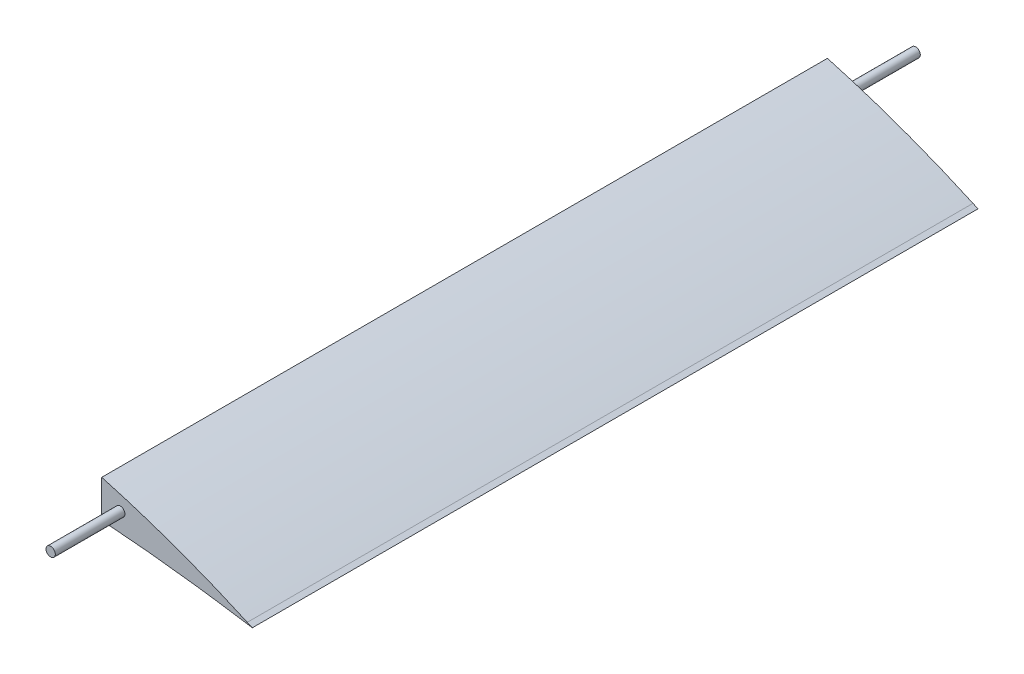
ISO-10303-21;
HEADER;
FILE_DESCRIPTION(('STEP AP214'),'2;1');
FILE_NAME('part.step','',(''),(''),'','','');
FILE_SCHEMA(('AUTOMOTIVE_DESIGN { 1 0 10303 214 1 1 1 1 }'));
ENDSEC;
DATA;
#1=APPLICATION_CONTEXT('core data for automotive mechanical design processes');
#2=APPLICATION_PROTOCOL_DEFINITION('international standard','automotive_design',2000,#1);
#3=PRODUCT_CONTEXT('',#1,'mechanical');
#4=PRODUCT('Part','Part','',(#3));
#5=PRODUCT_RELATED_PRODUCT_CATEGORY('part','',(#4));
#6=PRODUCT_DEFINITION_FORMATION('','',#4);
#7=PRODUCT_DEFINITION_CONTEXT('part definition',#1,'design');
#8=PRODUCT_DEFINITION('design','',#6,#7);
#9=PRODUCT_DEFINITION_SHAPE('','',#8);
#10=(LENGTH_UNIT() NAMED_UNIT(*) SI_UNIT(.MILLI.,.METRE.));
#11=(NAMED_UNIT(*) PLANE_ANGLE_UNIT() SI_UNIT($,.RADIAN.));
#12=(NAMED_UNIT(*) SI_UNIT($,.STERADIAN.) SOLID_ANGLE_UNIT());
#13=UNCERTAINTY_MEASURE_WITH_UNIT(LENGTH_MEASURE(1.E-05),#10,'distance_accuracy_value','');
#14=(GEOMETRIC_REPRESENTATION_CONTEXT(3) GLOBAL_UNCERTAINTY_ASSIGNED_CONTEXT((#13)) GLOBAL_UNIT_ASSIGNED_CONTEXT((#10,
#11,#12)) REPRESENTATION_CONTEXT('',''));
#15=CARTESIAN_POINT('',(0.,0.,0.));
#16=DIRECTION('',(0.,0.,1.));
#17=DIRECTION('',(1.,0.,0.));
#18=AXIS2_PLACEMENT_3D('',#15,#16,#17);
#19=CARTESIAN_POINT('',(250.0905,0.30175,156.25));
#20=CARTESIAN_POINT('',(249.967176894107,0.35752263832299,156.25));
#21=CARTESIAN_POINT('',(249.474705498551,0.580241883268078,156.25));
#22=CARTESIAN_POINT('',(248.368757841346,1.07747841310591,156.25));
#23=CARTESIAN_POINT('',(246.531056029016,1.8955784525877,156.25));
#24=CARTESIAN_POINT('',(243.970022782219,3.01871731606201,156.25));
#25=CARTESIAN_POINT('',(240.697484765675,4.42532167786361,156.25));
#26=CARTESIAN_POINT('',(236.72871806395,6.08814206011202,156.25));
#27=CARTESIAN_POINT('',(232.08320517829,7.97657015835399,156.25));
#28=CARTESIAN_POINT('',(226.7833477577,10.0543704050555,156.25));
#29=CARTESIAN_POINT('',(220.856263163566,12.2844632604579,156.25));
#30=CARTESIAN_POINT('',(214.33217995918,14.6253764831239,156.25));
#31=CARTESIAN_POINT('',(207.245873813889,17.0358391078329,156.25));
#32=CARTESIAN_POINT('',(199.635416935447,19.4725979309981,156.25));
#33=CARTESIAN_POINT('',(191.543137513553,21.8940901724419,156.25));
#34=CARTESIAN_POINT('',(183.014600537797,24.2576215915466,156.25));
#35=CARTESIAN_POINT('',(174.099363422309,26.5236055211011,156.25));
#36=CARTESIAN_POINT('',(164.849737603738,28.6527939579007,156.25));
#37=CARTESIAN_POINT('',(155.321752945394,30.6101951561386,156.25));
#38=CARTESIAN_POINT('',(145.574009320711,32.3628245621865,156.25));
#39=CARTESIAN_POINT('',(135.667857387076,33.8811203699661,156.25));
#40=CARTESIAN_POINT('',(125.666902669661,35.1397615192391,156.25));
#41=CARTESIAN_POINT('',(115.636778893083,36.1206951492421,156.25));
#42=CARTESIAN_POINT('',(105.594273822087,36.8040052373818,156.25));
#43=CARTESIAN_POINT('',(95.5386046152796,37.2048647786239,156.25));
#44=CARTESIAN_POINT('',(85.5334056894228,37.0417263557673,156.25));
#45=CARTESIAN_POINT('',(75.7162960028254,36.3460959013947,156.25));
#46=CARTESIAN_POINT('',(66.2327620791649,35.1462170608954,156.25));
#47=CARTESIAN_POINT('',(57.1612116585277,33.4870765936034,156.25));
#48=CARTESIAN_POINT('',(48.5745049403176,31.4247912402868,156.25));
#49=CARTESIAN_POINT('',(40.5394774491885,29.0234987715588,156.25));
#50=CARTESIAN_POINT('',(33.115756055849,26.3532239519005,156.25));
#51=CARTESIAN_POINT('',(26.3548013936068,23.4891938725338,156.25));
#52=CARTESIAN_POINT('',(20.2996352467683,20.5079300900761,156.25));
#53=CARTESIAN_POINT('',(14.985645432496,17.4842654454087,156.25));
#54=CARTESIAN_POINT('',(10.4389786574652,14.4912006544606,156.25));
#55=CARTESIAN_POINT('',(6.67800459667388,11.594758891072,156.25));
#56=CARTESIAN_POINT('',(3.71136110093971,8.85416843805436,156.25));
#57=CARTESIAN_POINT('',(1.53823778576287,6.31212100896774,156.25));
#58=CARTESIAN_POINT('',(0.150943097082421,3.99275266874957,156.25));
#59=CARTESIAN_POINT('',(-0.45614444229955,1.86405090981703,156.25));
#60=CARTESIAN_POINT('',(-0.145525786677318,-0.065678088071413,156.25));
#61=CARTESIAN_POINT('',(1.08739732510381,-1.57294223073602,156.25));
#62=CARTESIAN_POINT('',(3.04410280394939,-2.55158975669719,156.25));
#63=CARTESIAN_POINT('',(5.62541535338876,-3.12732752291929,156.25));
#64=CARTESIAN_POINT('',(8.8497907217855,-3.3551071695402,156.25));
#65=CARTESIAN_POINT('',(12.7045781823942,-3.26532942676434,156.25));
#66=CARTESIAN_POINT('',(17.1664203240035,-2.8881845510984,156.25));
#67=CARTESIAN_POINT('',(22.2028231197661,-2.2588386733316,156.25));
#68=CARTESIAN_POINT('',(27.7780430977115,-1.4178584524104,156.25));
#69=CARTESIAN_POINT('',(33.8542296815651,-0.407944024477627,156.25));
#70=CARTESIAN_POINT('',(40.3935268972945,0.722155474864518,156.25));
#71=CARTESIAN_POINT('',(47.3584639067136,1.92451417724157,156.25));
#72=CARTESIAN_POINT('',(54.7128381517971,3.14855921730592,156.25));
#73=CARTESIAN_POINT('',(62.4221188769073,4.34307850532654,156.25));
#74=CARTESIAN_POINT('',(70.4527646582886,5.45916854662171,156.25));
#75=CARTESIAN_POINT('',(78.7726503907477,6.44689167487461,156.25));
#76=CARTESIAN_POINT('',(87.3496429571334,7.26032455065863,156.25));
#77=CARTESIAN_POINT('',(96.2164638973013,7.8657481871473,156.25));
#78=CARTESIAN_POINT('',(105.384748536779,8.19610237970071,156.25));
#79=CARTESIAN_POINT('',(114.799513923917,8.48271364631913,156.25));
#80=CARTESIAN_POINT('',(124.348002519004,8.67384076630889,156.25));
#81=CARTESIAN_POINT('',(133.92514247836,8.7623241387427,156.25));
#82=CARTESIAN_POINT('',(143.475961555672,8.73632206981546,156.25));
#83=CARTESIAN_POINT('',(152.943999166261,8.59083900117681,156.25));
#84=CARTESIAN_POINT('',(162.272123673613,8.32655777834714,156.25));
#85=CARTESIAN_POINT('',(171.402666565114,7.9474255607619,156.25));
#86=CARTESIAN_POINT('',(180.278148269656,7.46252101091327,156.25));
#87=CARTESIAN_POINT('',(188.841392746962,6.88515378248476,156.25));
#88=CARTESIAN_POINT('',(197.036321835174,6.23087848886346,156.25));
#89=CARTESIAN_POINT('',(204.808324468592,5.51937507217559,156.25));
#90=CARTESIAN_POINT('',(212.104795112002,4.77110575381297,156.25));
#91=CARTESIAN_POINT('',(218.875568901886,4.00838196618106,156.25));
#92=CARTESIAN_POINT('',(225.073163797839,3.25261839708756,156.25));
#93=CARTESIAN_POINT('',(230.653596279947,2.52670852152898,156.25));
#94=CARTESIAN_POINT('',(235.576611829964,1.85043624235467,156.25));
#95=CARTESIAN_POINT('',(239.806204058984,1.24361891202603,156.25));
#96=CARTESIAN_POINT('',(243.311102365703,0.722290417982436,156.25));
#97=CARTESIAN_POINT('',(246.065118996063,0.301639984631635,156.25));
#98=CARTESIAN_POINT('',(248.04751140267,-0.00699818541889293,156.25));
#99=CARTESIAN_POINT('',(249.243010727156,-0.195573538045246,156.25));
#100=CARTESIAN_POINT('',(249.776002712031,-0.280482936455744,156.25));
#101=CARTESIAN_POINT('',(249.9095,-0.30175,156.25));
#102=B_SPLINE_CURVE_WITH_KNOTS('',3,(#19,#20,#21,#22,#23,#24,#25,#26,#27,#28,#29,#30,#31,#32,
#33,#34,#35,#36,#37,#38,#39,#40,#41,#42,#43,#44,#45,#46,#47,#48,#49,#50,#51,#52,#53,#54,#55,#56,
#57,#58,#59,#60,#61,#62,#63,#64,#65,#66,#67,#68,#69,#70,#71,#72,#73,#74,#75,#76,#77,#78,#79,#80,
#81,#82,#83,#84,#85,#86,#87,#88,#89,#90,#91,#92,#93,#94,#95,#96,#97,#98,#99,#100,#101),
.UNSPECIFIED.,.F.,.F.,(4,1,1,1,1,1,1,1,1,1,1,1,1,1,1,1,1,1,1,1,1,1,1,1,1,1,1,1,1,1,1,1,1,1,1,1,
1,1,1,1,1,1,1,1,1,1,1,1,1,1,1,1,1,1,1,1,1,1,1,1,1,1,1,1,1,1,1,1,1,1,1,1,1,1,1,1,1,1,1,1,4),(0.,
0.000780388582183262,0.00311635886366124,0.00699149024413847,0.0123786470723059,
0.0192401646191993,0.0275291163956377,0.0371885677458252,0.0481530149942945,0.0603504660709447,
0.0737004760732217,0.0881159007981916,0.103505480558388,0.119772437793277,0.136815166052434,
0.154528798804682,0.172805819916139,0.191536294297057,0.210606876525922,0.229904323703461,
0.249313148598133,0.268718115521033,0.288002831649334,0.307344574500995,0.326724912273379,
0.345665288003051,0.364062547904339,0.381812466131485,0.398810766796609,0.414954014976396,
0.43014108756859,0.44427604266255,0.457267491040306,0.469034145220341,0.479505483532797,
0.488628424505395,0.496374594308399,0.502754708449354,0.507846672805521,0.511863744250018,
0.515266594313617,0.518668431045945,0.522659442278019,0.527659106471716,0.533842014714074,
0.541252425567551,0.549872189932492,0.559649205945231,0.570512404563009,0.582379277891623,
0.595163200370055,0.608775429693724,0.623131519501752,0.638149690065564,0.653754504916732,
0.669877063709413,0.686453174210341,0.703424810142813,0.721111475555369,0.739345596232821,
0.75773392648224,0.776175562292332,0.794566548903596,0.812800595558257,0.830771125027306,
0.848370488551265,0.865489121687924,0.882020076559578,0.897855051622748,0.912888480818679,
0.927018156079293,0.940144761538347,0.952173577153425,0.963016384231875,0.972591069873466,
0.980824955512395,0.987652854315412,0.993021794116182,0.996888134736393,0.99922057819816,1.),.UNSPECIFIED.);
#103=DIRECTION('',(0.,0.,-1.));
#104=VECTOR('',#103,1.);
#105=SURFACE_OF_LINEAR_EXTRUSION('',#102,#104);
#106=CARTESIAN_POINT('',(250.0905,0.30175,-156.25));
#107=CARTESIAN_POINT('',(249.967176894107,0.35752263832299,-156.25));
#108=CARTESIAN_POINT('',(249.474705498551,0.580241883268078,-156.25));
#109=CARTESIAN_POINT('',(248.368757841346,1.07747841310591,-156.25));
#110=CARTESIAN_POINT('',(246.531056029016,1.8955784525877,-156.25));
#111=CARTESIAN_POINT('',(243.970022782219,3.01871731606201,-156.25));
#112=CARTESIAN_POINT('',(240.697484765675,4.42532167786361,-156.25));
#113=CARTESIAN_POINT('',(236.72871806395,6.08814206011202,-156.25));
#114=CARTESIAN_POINT('',(232.08320517829,7.97657015835399,-156.25));
#115=CARTESIAN_POINT('',(226.7833477577,10.0543704050555,-156.25));
#116=CARTESIAN_POINT('',(220.856263163566,12.2844632604579,-156.25));
#117=CARTESIAN_POINT('',(214.33217995918,14.6253764831239,-156.25));
#118=CARTESIAN_POINT('',(207.245873813889,17.0358391078329,-156.25));
#119=CARTESIAN_POINT('',(199.635416935447,19.4725979309981,-156.25));
#120=CARTESIAN_POINT('',(191.543137513553,21.8940901724419,-156.25));
#121=CARTESIAN_POINT('',(183.014600537797,24.2576215915466,-156.25));
#122=CARTESIAN_POINT('',(174.099363422309,26.5236055211011,-156.25));
#123=CARTESIAN_POINT('',(164.849737603738,28.6527939579007,-156.25));
#124=CARTESIAN_POINT('',(155.321752945394,30.6101951561386,-156.25));
#125=CARTESIAN_POINT('',(145.574009320711,32.3628245621865,-156.25));
#126=CARTESIAN_POINT('',(135.667857387076,33.8811203699661,-156.25));
#127=CARTESIAN_POINT('',(125.666902669661,35.1397615192391,-156.25));
#128=CARTESIAN_POINT('',(115.636778893083,36.1206951492421,-156.25));
#129=CARTESIAN_POINT('',(105.594273822087,36.8040052373818,-156.25));
#130=CARTESIAN_POINT('',(95.5386046152796,37.2048647786239,-156.25));
#131=CARTESIAN_POINT('',(85.5334056894228,37.0417263557673,-156.25));
#132=CARTESIAN_POINT('',(75.7162960028254,36.3460959013947,-156.25));
#133=CARTESIAN_POINT('',(66.2327620791649,35.1462170608954,-156.25));
#134=CARTESIAN_POINT('',(57.1612116585277,33.4870765936034,-156.25));
#135=CARTESIAN_POINT('',(48.5745049403176,31.4247912402868,-156.25));
#136=CARTESIAN_POINT('',(40.5394774491885,29.0234987715588,-156.25));
#137=CARTESIAN_POINT('',(33.115756055849,26.3532239519005,-156.25));
#138=CARTESIAN_POINT('',(26.3548013936068,23.4891938725338,-156.25));
#139=CARTESIAN_POINT('',(20.2996352467683,20.5079300900761,-156.25));
#140=CARTESIAN_POINT('',(14.985645432496,17.4842654454087,-156.25));
#141=CARTESIAN_POINT('',(10.4389786574652,14.4912006544606,-156.25));
#142=CARTESIAN_POINT('',(6.67800459667388,11.594758891072,-156.25));
#143=CARTESIAN_POINT('',(3.71136110093971,8.85416843805436,-156.25));
#144=CARTESIAN_POINT('',(1.53823778576287,6.31212100896774,-156.25));
#145=CARTESIAN_POINT('',(0.150943097082421,3.99275266874957,-156.25));
#146=CARTESIAN_POINT('',(-0.45614444229955,1.86405090981703,-156.25));
#147=CARTESIAN_POINT('',(-0.145525786677318,-0.065678088071413,-156.25));
#148=CARTESIAN_POINT('',(1.08739732510381,-1.57294223073602,-156.25));
#149=CARTESIAN_POINT('',(3.04410280394939,-2.55158975669719,-156.25));
#150=CARTESIAN_POINT('',(5.62541535338876,-3.12732752291929,-156.25));
#151=CARTESIAN_POINT('',(8.8497907217855,-3.3551071695402,-156.25));
#152=CARTESIAN_POINT('',(12.7045781823942,-3.26532942676434,-156.25));
#153=CARTESIAN_POINT('',(17.1664203240035,-2.8881845510984,-156.25));
#154=CARTESIAN_POINT('',(22.2028231197661,-2.2588386733316,-156.25));
#155=CARTESIAN_POINT('',(27.7780430977115,-1.4178584524104,-156.25));
#156=CARTESIAN_POINT('',(33.8542296815651,-0.407944024477627,-156.25));
#157=CARTESIAN_POINT('',(40.3935268972945,0.722155474864518,-156.25));
#158=CARTESIAN_POINT('',(47.3584639067136,1.92451417724157,-156.25));
#159=CARTESIAN_POINT('',(54.7128381517971,3.14855921730592,-156.25));
#160=CARTESIAN_POINT('',(62.4221188769073,4.34307850532654,-156.25));
#161=CARTESIAN_POINT('',(70.4527646582886,5.45916854662171,-156.25));
#162=CARTESIAN_POINT('',(78.7726503907477,6.44689167487461,-156.25));
#163=CARTESIAN_POINT('',(87.3496429571334,7.26032455065863,-156.25));
#164=CARTESIAN_POINT('',(96.2164638973013,7.8657481871473,-156.25));
#165=CARTESIAN_POINT('',(105.384748536779,8.19610237970071,-156.25));
#166=CARTESIAN_POINT('',(114.799513923917,8.48271364631913,-156.25));
#167=CARTESIAN_POINT('',(124.348002519004,8.67384076630889,-156.25));
#168=CARTESIAN_POINT('',(133.92514247836,8.7623241387427,-156.25));
#169=CARTESIAN_POINT('',(143.475961555672,8.73632206981546,-156.25));
#170=CARTESIAN_POINT('',(152.943999166261,8.59083900117681,-156.25));
#171=CARTESIAN_POINT('',(162.272123673613,8.32655777834714,-156.25));
#172=CARTESIAN_POINT('',(171.402666565114,7.9474255607619,-156.25));
#173=CARTESIAN_POINT('',(180.278148269656,7.46252101091327,-156.25));
#174=CARTESIAN_POINT('',(188.841392746962,6.88515378248476,-156.25));
#175=CARTESIAN_POINT('',(197.036321835174,6.23087848886346,-156.25));
#176=CARTESIAN_POINT('',(204.808324468592,5.51937507217559,-156.25));
#177=CARTESIAN_POINT('',(212.104795112002,4.77110575381297,-156.25));
#178=CARTESIAN_POINT('',(218.875568901886,4.00838196618106,-156.25));
#179=CARTESIAN_POINT('',(225.073163797839,3.25261839708756,-156.25));
#180=CARTESIAN_POINT('',(230.653596279947,2.52670852152898,-156.25));
#181=CARTESIAN_POINT('',(235.576611829964,1.85043624235467,-156.25));
#182=CARTESIAN_POINT('',(239.806204058984,1.24361891202603,-156.25));
#183=CARTESIAN_POINT('',(243.311102365703,0.722290417982436,-156.25));
#184=CARTESIAN_POINT('',(246.065118996063,0.301639984631635,-156.25));
#185=CARTESIAN_POINT('',(248.04751140267,-0.00699818541889293,-156.25));
#186=CARTESIAN_POINT('',(249.243010727156,-0.195573538045246,-156.25));
#187=CARTESIAN_POINT('',(249.776002712031,-0.280482936455744,-156.25));
#188=CARTESIAN_POINT('',(249.9095,-0.30175,-156.25));
#189=B_SPLINE_CURVE_WITH_KNOTS('',3,(#106,#107,#108,#109,#110,#111,#112,#113,#114,#115,#116,
#117,#118,#119,#120,#121,#122,#123,#124,#125,#126,#127,#128,#129,#130,#131,#132,#133,#134,#135,
#136,#137,#138,#139,#140,#141,#142,#143,#144,#145,#146,#147,#148,#149,#150,#151,#152,#153,#154,
#155,#156,#157,#158,#159,#160,#161,#162,#163,#164,#165,#166,#167,#168,#169,#170,#171,#172,#173,
#174,#175,#176,#177,#178,#179,#180,#181,#182,#183,#184,#185,#186,#187,#188),.UNSPECIFIED.,.F.,
.F.,(4,1,1,1,1,1,1,1,1,1,1,1,1,1,1,1,1,1,1,1,1,1,1,1,1,1,1,1,1,1,1,1,1,1,1,1,1,1,1,1,1,1,1,1,1,
1,1,1,1,1,1,1,1,1,1,1,1,1,1,1,1,1,1,1,1,1,1,1,1,1,1,1,1,1,1,1,1,1,1,1,4),(0.,
0.000780388582183262,0.00311635886366124,0.00699149024413847,0.0123786470723059,
0.0192401646191993,0.0275291163956377,0.0371885677458252,0.0481530149942945,0.0603504660709447,
0.0737004760732217,0.0881159007981916,0.103505480558388,0.119772437793277,0.136815166052434,
0.154528798804682,0.172805819916139,0.191536294297057,0.210606876525922,0.229904323703461,
0.249313148598133,0.268718115521033,0.288002831649334,0.307344574500995,0.326724912273379,
0.345665288003051,0.364062547904339,0.381812466131485,0.398810766796609,0.414954014976396,
0.43014108756859,0.44427604266255,0.457267491040306,0.469034145220341,0.479505483532797,
0.488628424505395,0.496374594308399,0.502754708449354,0.507846672805521,0.511863744250018,
0.515266594313617,0.518668431045945,0.522659442278019,0.527659106471716,0.533842014714074,
0.541252425567551,0.549872189932492,0.559649205945231,0.570512404563009,0.582379277891623,
0.595163200370055,0.608775429693724,0.623131519501752,0.638149690065564,0.653754504916732,
0.669877063709413,0.686453174210341,0.703424810142813,0.721111475555369,0.739345596232821,
0.75773392648224,0.776175562292332,0.794566548903596,0.812800595558257,0.830771125027306,
0.848370488551265,0.865489121687924,0.882020076559578,0.897855051622748,0.912888480818679,
0.927018156079293,0.940144761538347,0.952173577153425,0.963016384231875,0.972591069873466,
0.980824955512395,0.987652854315412,0.993021794116182,0.996888134736393,0.99922057819816,1.),.UNSPECIFIED.);
#190=CARTESIAN_POINT('',(250.0905,0.30175,-156.25));
#191=VERTEX_POINT('',#190);
#192=CARTESIAN_POINT('',(187.409499991781,23.0316183483653,-156.25));
#193=VERTEX_POINT('',#192);
#194=EDGE_CURVE('E128',#191,#193,#189,.T.);
#195=ORIENTED_EDGE('',*,*,#194,.T.);
#196=DIRECTION('',(0.,0.,-1.));
#197=VECTOR('',#196,1.);
#198=CARTESIAN_POINT('',(187.409499991781,23.0316183483653,156.25));
#199=LINE('',#198,#197);
#200=CARTESIAN_POINT('',(187.409499991781,23.0316183483653,156.25));
#201=VERTEX_POINT('',#200);
#202=EDGE_CURVE('E159',#201,#193,#199,.T.);
#203=ORIENTED_EDGE('',*,*,#202,.F.);
#204=CARTESIAN_POINT('',(250.0905,0.30175,156.25));
#205=VERTEX_POINT('',#204);
#206=EDGE_CURVE('E152',#205,#201,#102,.T.);
#207=ORIENTED_EDGE('',*,*,#206,.F.);
#208=DIRECTION('',(0.,0.,-1.));
#209=VECTOR('',#208,1.);
#210=CARTESIAN_POINT('',(250.0905,0.30175,156.25));
#211=LINE('',#210,#209);
#212=EDGE_CURVE('E121',#205,#191,#211,.T.);
#213=ORIENTED_EDGE('',*,*,#212,.T.);
#214=EDGE_LOOP('',(#195,#203,#207,#213));
#215=FACE_BOUND('',#214,.T.);
#216=ADVANCED_FACE('F43',(#215),#105,.F.);
#217=CARTESIAN_POINT('',(187.409499991781,23.0316183483653,156.25));
#218=DIRECTION('',(1.,0.,0.));
#219=DIRECTION('',(0.,1.,0.));
#220=AXIS2_PLACEMENT_3D('',#217,#218,#219);
#221=PLANE('',#220);
#222=DIRECTION('',(0.,-1.,0.));
#223=VECTOR('',#222,1.);
#224=CARTESIAN_POINT('',(187.409499991781,23.0316183483653,-156.25));
#225=LINE('',#224,#223);
#226=CARTESIAN_POINT('',(187.409499991826,6.97162784030531,-156.25));
#227=VERTEX_POINT('',#226);
#228=EDGE_CURVE('E134',#193,#227,#225,.T.);
#229=ORIENTED_EDGE('',*,*,#228,.T.);
#230=DIRECTION('',(0.,0.,-1.));
#231=VECTOR('',#230,1.);
#232=CARTESIAN_POINT('',(187.409499991826,6.97162784030531,156.25));
#233=LINE('',#232,#231);
#234=CARTESIAN_POINT('',(187.409499991826,6.97162784030531,156.25));
#235=VERTEX_POINT('',#234);
#236=EDGE_CURVE('E114',#235,#227,#233,.T.);
#237=ORIENTED_EDGE('',*,*,#236,.F.);
#238=DIRECTION('',(0.,-1.,0.));
#239=VECTOR('',#238,1.);
#240=CARTESIAN_POINT('',(187.409499991781,23.0316183483653,156.25));
#241=LINE('',#240,#239);
#242=EDGE_CURVE('E96',#201,#235,#241,.T.);
#243=ORIENTED_EDGE('',*,*,#242,.F.);
#244=ORIENTED_EDGE('',*,*,#202,.T.);
#245=EDGE_LOOP('',(#229,#237,#243,#244));
#246=FACE_BOUND('',#245,.T.);
#247=ADVANCED_FACE('F180',(#246),#221,.F.);
#248=CARTESIAN_POINT('',(250.0905,0.30175,156.25));
#249=CARTESIAN_POINT('',(249.967176894107,0.35752263832299,156.25));
#250=CARTESIAN_POINT('',(249.474705498551,0.580241883268078,156.25));
#251=CARTESIAN_POINT('',(248.368757841346,1.07747841310591,156.25));
#252=CARTESIAN_POINT('',(246.531056029016,1.8955784525877,156.25));
#253=CARTESIAN_POINT('',(243.970022782219,3.01871731606201,156.25));
#254=CARTESIAN_POINT('',(240.697484765675,4.42532167786361,156.25));
#255=CARTESIAN_POINT('',(236.72871806395,6.08814206011202,156.25));
#256=CARTESIAN_POINT('',(232.08320517829,7.97657015835399,156.25));
#257=CARTESIAN_POINT('',(226.7833477577,10.0543704050555,156.25));
#258=CARTESIAN_POINT('',(220.856263163566,12.2844632604579,156.25));
#259=CARTESIAN_POINT('',(214.33217995918,14.6253764831239,156.25));
#260=CARTESIAN_POINT('',(207.245873813889,17.0358391078329,156.25));
#261=CARTESIAN_POINT('',(199.635416935447,19.4725979309981,156.25));
#262=CARTESIAN_POINT('',(191.543137513553,21.8940901724419,156.25));
#263=CARTESIAN_POINT('',(183.014600537797,24.2576215915466,156.25));
#264=CARTESIAN_POINT('',(174.099363422309,26.5236055211011,156.25));
#265=CARTESIAN_POINT('',(164.849737603738,28.6527939579007,156.25));
#266=CARTESIAN_POINT('',(155.321752945394,30.6101951561386,156.25));
#267=CARTESIAN_POINT('',(145.574009320711,32.3628245621865,156.25));
#268=CARTESIAN_POINT('',(135.667857387076,33.8811203699661,156.25));
#269=CARTESIAN_POINT('',(125.666902669661,35.1397615192391,156.25));
#270=CARTESIAN_POINT('',(115.636778893083,36.1206951492421,156.25));
#271=CARTESIAN_POINT('',(105.594273822087,36.8040052373818,156.25));
#272=CARTESIAN_POINT('',(95.5386046152796,37.2048647786239,156.25));
#273=CARTESIAN_POINT('',(85.5334056894228,37.0417263557673,156.25));
#274=CARTESIAN_POINT('',(75.7162960028254,36.3460959013947,156.25));
#275=CARTESIAN_POINT('',(66.2327620791649,35.1462170608954,156.25));
#276=CARTESIAN_POINT('',(57.1612116585277,33.4870765936034,156.25));
#277=CARTESIAN_POINT('',(48.5745049403176,31.4247912402868,156.25));
#278=CARTESIAN_POINT('',(40.5394774491885,29.0234987715588,156.25));
#279=CARTESIAN_POINT('',(33.115756055849,26.3532239519005,156.25));
#280=CARTESIAN_POINT('',(26.3548013936068,23.4891938725338,156.25));
#281=CARTESIAN_POINT('',(20.2996352467683,20.5079300900761,156.25));
#282=CARTESIAN_POINT('',(14.985645432496,17.4842654454087,156.25));
#283=CARTESIAN_POINT('',(10.4389786574652,14.4912006544606,156.25));
#284=CARTESIAN_POINT('',(6.67800459667388,11.594758891072,156.25));
#285=CARTESIAN_POINT('',(3.71136110093971,8.85416843805436,156.25));
#286=CARTESIAN_POINT('',(1.53823778576287,6.31212100896774,156.25));
#287=CARTESIAN_POINT('',(0.150943097082421,3.99275266874957,156.25));
#288=CARTESIAN_POINT('',(-0.45614444229955,1.86405090981703,156.25));
#289=CARTESIAN_POINT('',(-0.145525786677318,-0.065678088071413,156.25));
#290=CARTESIAN_POINT('',(1.08739732510381,-1.57294223073602,156.25));
#291=CARTESIAN_POINT('',(3.04410280394939,-2.55158975669719,156.25));
#292=CARTESIAN_POINT('',(5.62541535338876,-3.12732752291929,156.25));
#293=CARTESIAN_POINT('',(8.8497907217855,-3.3551071695402,156.25));
#294=CARTESIAN_POINT('',(12.7045781823942,-3.26532942676434,156.25));
#295=CARTESIAN_POINT('',(17.1664203240035,-2.8881845510984,156.25));
#296=CARTESIAN_POINT('',(22.2028231197661,-2.2588386733316,156.25));
#297=CARTESIAN_POINT('',(27.7780430977115,-1.4178584524104,156.25));
#298=CARTESIAN_POINT('',(33.8542296815651,-0.407944024477627,156.25));
#299=CARTESIAN_POINT('',(40.3935268972945,0.722155474864518,156.25));
#300=CARTESIAN_POINT('',(47.3584639067136,1.92451417724157,156.25));
#301=CARTESIAN_POINT('',(54.7128381517971,3.14855921730592,156.25));
#302=CARTESIAN_POINT('',(62.4221188769073,4.34307850532654,156.25));
#303=CARTESIAN_POINT('',(70.4527646582886,5.45916854662171,156.25));
#304=CARTESIAN_POINT('',(78.7726503907477,6.44689167487461,156.25));
#305=CARTESIAN_POINT('',(87.3496429571334,7.26032455065863,156.25));
#306=CARTESIAN_POINT('',(96.2164638973013,7.8657481871473,156.25));
#307=CARTESIAN_POINT('',(105.384748536779,8.19610237970071,156.25));
#308=CARTESIAN_POINT('',(114.799513923917,8.48271364631913,156.25));
#309=CARTESIAN_POINT('',(124.348002519004,8.67384076630889,156.25));
#310=CARTESIAN_POINT('',(133.92514247836,8.7623241387427,156.25));
#311=CARTESIAN_POINT('',(143.475961555672,8.73632206981546,156.25));
#312=CARTESIAN_POINT('',(152.943999166261,8.59083900117681,156.25));
#313=CARTESIAN_POINT('',(162.272123673613,8.32655777834714,156.25));
#314=CARTESIAN_POINT('',(171.402666565114,7.9474255607619,156.25));
#315=CARTESIAN_POINT('',(180.278148269656,7.46252101091327,156.25));
#316=CARTESIAN_POINT('',(188.841392746962,6.88515378248476,156.25));
#317=CARTESIAN_POINT('',(197.036321835174,6.23087848886346,156.25));
#318=CARTESIAN_POINT('',(204.808324468592,5.51937507217559,156.25));
#319=CARTESIAN_POINT('',(212.104795112002,4.77110575381297,156.25));
#320=CARTESIAN_POINT('',(218.875568901886,4.00838196618106,156.25));
#321=CARTESIAN_POINT('',(225.073163797839,3.25261839708756,156.25));
#322=CARTESIAN_POINT('',(230.653596279947,2.52670852152898,156.25));
#323=CARTESIAN_POINT('',(235.576611829964,1.85043624235467,156.25));
#324=CARTESIAN_POINT('',(239.806204058984,1.24361891202603,156.25));
#325=CARTESIAN_POINT('',(243.311102365703,0.722290417982436,156.25));
#326=CARTESIAN_POINT('',(246.065118996063,0.301639984631635,156.25));
#327=CARTESIAN_POINT('',(248.04751140267,-0.00699818541889293,156.25));
#328=CARTESIAN_POINT('',(249.243010727156,-0.195573538045246,156.25));
#329=CARTESIAN_POINT('',(249.776002712031,-0.280482936455744,156.25));
#330=CARTESIAN_POINT('',(249.9095,-0.30175,156.25));
#331=B_SPLINE_CURVE_WITH_KNOTS('',3,(#248,#249,#250,#251,#252,#253,#254,#255,#256,#257,#258,
#259,#260,#261,#262,#263,#264,#265,#266,#267,#268,#269,#270,#271,#272,#273,#274,#275,#276,#277,
#278,#279,#280,#281,#282,#283,#284,#285,#286,#287,#288,#289,#290,#291,#292,#293,#294,#295,#296,
#297,#298,#299,#300,#301,#302,#303,#304,#305,#306,#307,#308,#309,#310,#311,#312,#313,#314,#315,
#316,#317,#318,#319,#320,#321,#322,#323,#324,#325,#326,#327,#328,#329,#330),.UNSPECIFIED.,.F.,
.F.,(4,1,1,1,1,1,1,1,1,1,1,1,1,1,1,1,1,1,1,1,1,1,1,1,1,1,1,1,1,1,1,1,1,1,1,1,1,1,1,1,1,1,1,1,1,
1,1,1,1,1,1,1,1,1,1,1,1,1,1,1,1,1,1,1,1,1,1,1,1,1,1,1,1,1,1,1,1,1,1,1,4),(0.,
0.000780388582183262,0.00311635886366124,0.00699149024413847,0.0123786470723059,
0.0192401646191993,0.0275291163956377,0.0371885677458252,0.0481530149942945,0.0603504660709447,
0.0737004760732217,0.0881159007981916,0.103505480558388,0.119772437793277,0.136815166052434,
0.154528798804682,0.172805819916139,0.191536294297057,0.210606876525922,0.229904323703461,
0.249313148598133,0.268718115521033,0.288002831649334,0.307344574500995,0.326724912273379,
0.345665288003051,0.364062547904339,0.381812466131485,0.398810766796609,0.414954014976396,
0.43014108756859,0.44427604266255,0.457267491040306,0.469034145220341,0.479505483532797,
0.488628424505395,0.496374594308399,0.502754708449354,0.507846672805521,0.511863744250018,
0.515266594313617,0.518668431045945,0.522659442278019,0.527659106471716,0.533842014714074,
0.541252425567551,0.549872189932492,0.559649205945231,0.570512404563009,0.582379277891623,
0.595163200370055,0.608775429693724,0.623131519501752,0.638149690065564,0.653754504916732,
0.669877063709413,0.686453174210341,0.703424810142813,0.721111475555369,0.739345596232821,
0.75773392648224,0.776175562292332,0.794566548903596,0.812800595558257,0.830771125027306,
0.848370488551265,0.865489121687924,0.882020076559578,0.897855051622748,0.912888480818679,
0.927018156079293,0.940144761538347,0.952173577153425,0.963016384231875,0.972591069873466,
0.980824955512395,0.987652854315412,0.993021794116182,0.996888134736393,0.99922057819816,1.),.UNSPECIFIED.);
#332=DIRECTION('',(0.,0.,-1.));
#333=VECTOR('',#332,1.);
#334=SURFACE_OF_LINEAR_EXTRUSION('',#331,#333);
#335=CARTESIAN_POINT('',(250.0905,0.30175,-156.25));
#336=CARTESIAN_POINT('',(249.967176894107,0.35752263832299,-156.25));
#337=CARTESIAN_POINT('',(249.474705498551,0.580241883268078,-156.25));
#338=CARTESIAN_POINT('',(248.368757841346,1.07747841310591,-156.25));
#339=CARTESIAN_POINT('',(246.531056029016,1.8955784525877,-156.25));
#340=CARTESIAN_POINT('',(243.970022782219,3.01871731606201,-156.25));
#341=CARTESIAN_POINT('',(240.697484765675,4.42532167786361,-156.25));
#342=CARTESIAN_POINT('',(236.72871806395,6.08814206011202,-156.25));
#343=CARTESIAN_POINT('',(232.08320517829,7.97657015835399,-156.25));
#344=CARTESIAN_POINT('',(226.7833477577,10.0543704050555,-156.25));
#345=CARTESIAN_POINT('',(220.856263163566,12.2844632604579,-156.25));
#346=CARTESIAN_POINT('',(214.33217995918,14.6253764831239,-156.25));
#347=CARTESIAN_POINT('',(207.245873813889,17.0358391078329,-156.25));
#348=CARTESIAN_POINT('',(199.635416935447,19.4725979309981,-156.25));
#349=CARTESIAN_POINT('',(191.543137513553,21.8940901724419,-156.25));
#350=CARTESIAN_POINT('',(183.014600537797,24.2576215915466,-156.25));
#351=CARTESIAN_POINT('',(174.099363422309,26.5236055211011,-156.25));
#352=CARTESIAN_POINT('',(164.849737603738,28.6527939579007,-156.25));
#353=CARTESIAN_POINT('',(155.321752945394,30.6101951561386,-156.25));
#354=CARTESIAN_POINT('',(145.574009320711,32.3628245621865,-156.25));
#355=CARTESIAN_POINT('',(135.667857387076,33.8811203699661,-156.25));
#356=CARTESIAN_POINT('',(125.666902669661,35.1397615192391,-156.25));
#357=CARTESIAN_POINT('',(115.636778893083,36.1206951492421,-156.25));
#358=CARTESIAN_POINT('',(105.594273822087,36.8040052373818,-156.25));
#359=CARTESIAN_POINT('',(95.5386046152796,37.2048647786239,-156.25));
#360=CARTESIAN_POINT('',(85.5334056894228,37.0417263557673,-156.25));
#361=CARTESIAN_POINT('',(75.7162960028254,36.3460959013947,-156.25));
#362=CARTESIAN_POINT('',(66.2327620791649,35.1462170608954,-156.25));
#363=CARTESIAN_POINT('',(57.1612116585277,33.4870765936034,-156.25));
#364=CARTESIAN_POINT('',(48.5745049403176,31.4247912402868,-156.25));
#365=CARTESIAN_POINT('',(40.5394774491885,29.0234987715588,-156.25));
#366=CARTESIAN_POINT('',(33.115756055849,26.3532239519005,-156.25));
#367=CARTESIAN_POINT('',(26.3548013936068,23.4891938725338,-156.25));
#368=CARTESIAN_POINT('',(20.2996352467683,20.5079300900761,-156.25));
#369=CARTESIAN_POINT('',(14.985645432496,17.4842654454087,-156.25));
#370=CARTESIAN_POINT('',(10.4389786574652,14.4912006544606,-156.25));
#371=CARTESIAN_POINT('',(6.67800459667388,11.594758891072,-156.25));
#372=CARTESIAN_POINT('',(3.71136110093971,8.85416843805436,-156.25));
#373=CARTESIAN_POINT('',(1.53823778576287,6.31212100896774,-156.25));
#374=CARTESIAN_POINT('',(0.150943097082421,3.99275266874957,-156.25));
#375=CARTESIAN_POINT('',(-0.45614444229955,1.86405090981703,-156.25));
#376=CARTESIAN_POINT('',(-0.145525786677318,-0.065678088071413,-156.25));
#377=CARTESIAN_POINT('',(1.08739732510381,-1.57294223073602,-156.25));
#378=CARTESIAN_POINT('',(3.04410280394939,-2.55158975669719,-156.25));
#379=CARTESIAN_POINT('',(5.62541535338876,-3.12732752291929,-156.25));
#380=CARTESIAN_POINT('',(8.8497907217855,-3.3551071695402,-156.25));
#381=CARTESIAN_POINT('',(12.7045781823942,-3.26532942676434,-156.25));
#382=CARTESIAN_POINT('',(17.1664203240035,-2.8881845510984,-156.25));
#383=CARTESIAN_POINT('',(22.2028231197661,-2.2588386733316,-156.25));
#384=CARTESIAN_POINT('',(27.7780430977115,-1.4178584524104,-156.25));
#385=CARTESIAN_POINT('',(33.8542296815651,-0.407944024477627,-156.25));
#386=CARTESIAN_POINT('',(40.3935268972945,0.722155474864518,-156.25));
#387=CARTESIAN_POINT('',(47.3584639067136,1.92451417724157,-156.25));
#388=CARTESIAN_POINT('',(54.7128381517971,3.14855921730592,-156.25));
#389=CARTESIAN_POINT('',(62.4221188769073,4.34307850532654,-156.25));
#390=CARTESIAN_POINT('',(70.4527646582886,5.45916854662171,-156.25));
#391=CARTESIAN_POINT('',(78.7726503907477,6.44689167487461,-156.25));
#392=CARTESIAN_POINT('',(87.3496429571334,7.26032455065863,-156.25));
#393=CARTESIAN_POINT('',(96.2164638973013,7.8657481871473,-156.25));
#394=CARTESIAN_POINT('',(105.384748536779,8.19610237970071,-156.25));
#395=CARTESIAN_POINT('',(114.799513923917,8.48271364631913,-156.25));
#396=CARTESIAN_POINT('',(124.348002519004,8.67384076630889,-156.25));
#397=CARTESIAN_POINT('',(133.92514247836,8.7623241387427,-156.25));
#398=CARTESIAN_POINT('',(143.475961555672,8.73632206981546,-156.25));
#399=CARTESIAN_POINT('',(152.943999166261,8.59083900117681,-156.25));
#400=CARTESIAN_POINT('',(162.272123673613,8.32655777834714,-156.25));
#401=CARTESIAN_POINT('',(171.402666565114,7.9474255607619,-156.25));
#402=CARTESIAN_POINT('',(180.278148269656,7.46252101091327,-156.25));
#403=CARTESIAN_POINT('',(188.841392746962,6.88515378248476,-156.25));
#404=CARTESIAN_POINT('',(197.036321835174,6.23087848886346,-156.25));
#405=CARTESIAN_POINT('',(204.808324468592,5.51937507217559,-156.25));
#406=CARTESIAN_POINT('',(212.104795112002,4.77110575381297,-156.25));
#407=CARTESIAN_POINT('',(218.875568901886,4.00838196618106,-156.25));
#408=CARTESIAN_POINT('',(225.073163797839,3.25261839708756,-156.25));
#409=CARTESIAN_POINT('',(230.653596279947,2.52670852152898,-156.25));
#410=CARTESIAN_POINT('',(235.576611829964,1.85043624235467,-156.25));
#411=CARTESIAN_POINT('',(239.806204058984,1.24361891202603,-156.25));
#412=CARTESIAN_POINT('',(243.311102365703,0.722290417982436,-156.25));
#413=CARTESIAN_POINT('',(246.065118996063,0.301639984631635,-156.25));
#414=CARTESIAN_POINT('',(248.04751140267,-0.00699818541889293,-156.25));
#415=CARTESIAN_POINT('',(249.243010727156,-0.195573538045246,-156.25));
#416=CARTESIAN_POINT('',(249.776002712031,-0.280482936455744,-156.25));
#417=CARTESIAN_POINT('',(249.9095,-0.30175,-156.25));
#418=B_SPLINE_CURVE_WITH_KNOTS('',3,(#335,#336,#337,#338,#339,#340,#341,#342,#343,#344,#345,
#346,#347,#348,#349,#350,#351,#352,#353,#354,#355,#356,#357,#358,#359,#360,#361,#362,#363,#364,
#365,#366,#367,#368,#369,#370,#371,#372,#373,#374,#375,#376,#377,#378,#379,#380,#381,#382,#383,
#384,#385,#386,#387,#388,#389,#390,#391,#392,#393,#394,#395,#396,#397,#398,#399,#400,#401,#402,
#403,#404,#405,#406,#407,#408,#409,#410,#411,#412,#413,#414,#415,#416,#417),.UNSPECIFIED.,.F.,
.F.,(4,1,1,1,1,1,1,1,1,1,1,1,1,1,1,1,1,1,1,1,1,1,1,1,1,1,1,1,1,1,1,1,1,1,1,1,1,1,1,1,1,1,1,1,1,
1,1,1,1,1,1,1,1,1,1,1,1,1,1,1,1,1,1,1,1,1,1,1,1,1,1,1,1,1,1,1,1,1,1,1,4),(0.,
0.000780388582183262,0.00311635886366124,0.00699149024413847,0.0123786470723059,
0.0192401646191993,0.0275291163956377,0.0371885677458252,0.0481530149942945,0.0603504660709447,
0.0737004760732217,0.0881159007981916,0.103505480558388,0.119772437793277,0.136815166052434,
0.154528798804682,0.172805819916139,0.191536294297057,0.210606876525922,0.229904323703461,
0.249313148598133,0.268718115521033,0.288002831649334,0.307344574500995,0.326724912273379,
0.345665288003051,0.364062547904339,0.381812466131485,0.398810766796609,0.414954014976396,
0.43014108756859,0.44427604266255,0.457267491040306,0.469034145220341,0.479505483532797,
0.488628424505395,0.496374594308399,0.502754708449354,0.507846672805521,0.511863744250018,
0.515266594313617,0.518668431045945,0.522659442278019,0.527659106471716,0.533842014714074,
0.541252425567551,0.549872189932492,0.559649205945231,0.570512404563009,0.582379277891623,
0.595163200370055,0.608775429693724,0.623131519501752,0.638149690065564,0.653754504916732,
0.669877063709413,0.686453174210341,0.703424810142813,0.721111475555369,0.739345596232821,
0.75773392648224,0.776175562292332,0.794566548903596,0.812800595558257,0.830771125027306,
0.848370488551265,0.865489121687924,0.882020076559578,0.897855051622748,0.912888480818679,
0.927018156079293,0.940144761538347,0.952173577153425,0.963016384231875,0.972591069873466,
0.980824955512395,0.987652854315412,0.993021794116182,0.996888134736393,0.99922057819816,1.),.UNSPECIFIED.);
#419=CARTESIAN_POINT('',(249.9095,-0.30175,-156.25));
#420=VERTEX_POINT('',#419);
#421=EDGE_CURVE('E112',#227,#420,#418,.T.);
#422=ORIENTED_EDGE('',*,*,#421,.T.);
#423=DIRECTION('',(0.,0.,-1.));
#424=VECTOR('',#423,1.);
#425=CARTESIAN_POINT('',(249.9095,-0.30175,156.25));
#426=LINE('',#425,#424);
#427=CARTESIAN_POINT('',(249.9095,-0.30175,156.25));
#428=VERTEX_POINT('',#427);
#429=EDGE_CURVE('E109',#428,#420,#426,.T.);
#430=ORIENTED_EDGE('',*,*,#429,.F.);
#431=EDGE_CURVE('E100',#235,#428,#331,.T.);
#432=ORIENTED_EDGE('',*,*,#431,.F.);
#433=ORIENTED_EDGE('',*,*,#236,.T.);
#434=EDGE_LOOP('',(#422,#430,#432,#433));
#435=FACE_BOUND('',#434,.T.);
#436=ADVANCED_FACE('F110',(#435),#334,.F.);
#437=CARTESIAN_POINT('',(249.9095,-0.30175,156.25));
#438=DIRECTION('',(0.157323257410311,0.987547159723428,0.));
#439=DIRECTION('',(-0.987547159723428,0.157323257410311,0.));
#440=AXIS2_PLACEMENT_3D('',#437,#438,#439);
#441=PLANE('',#440);
#442=DIRECTION('',(0.987547159723428,-0.157323257410311,0.));
#443=VECTOR('',#442,1.);
#444=CARTESIAN_POINT('',(249.9095,-0.30175,-156.25));
#445=LINE('',#444,#443);
#446=CARTESIAN_POINT('',(252.249073161681,-0.67446057601788,-156.25));
#447=VERTEX_POINT('',#446);
#448=EDGE_CURVE('E81',#420,#447,#445,.T.);
#449=ORIENTED_EDGE('',*,*,#448,.T.);
#450=DIRECTION('',(0.,0.,-1.));
#451=VECTOR('',#450,1.);
#452=CARTESIAN_POINT('',(252.249073161681,-0.67446057601788,156.25));
#453=LINE('',#452,#451);
#454=CARTESIAN_POINT('',(252.249073161681,-0.67446057601788,156.25));
#455=VERTEX_POINT('',#454);
#456=EDGE_CURVE('E115',#455,#447,#453,.T.);
#457=ORIENTED_EDGE('',*,*,#456,.F.);
#458=DIRECTION('',(0.987547159723428,-0.157323257410311,0.));
#459=VECTOR('',#458,1.);
#460=CARTESIAN_POINT('',(249.9095,-0.30175,156.25));
#461=LINE('',#460,#459);
#462=EDGE_CURVE('E104',#428,#455,#461,.T.);
#463=ORIENTED_EDGE('',*,*,#462,.F.);
#464=ORIENTED_EDGE('',*,*,#429,.T.);
#465=EDGE_LOOP('',(#449,#457,#463,#464));
#466=FACE_BOUND('',#465,.T.);
#467=ADVANCED_FACE('F117',(#466),#441,.F.);
#468=CARTESIAN_POINT('',(250.0905,0.30175,156.25));
#469=DIRECTION('',(-0.412067370237253,-0.911153380274559,0.));
#470=DIRECTION('',(0.911153380274559,-0.412067370237253,0.));
#471=AXIS2_PLACEMENT_3D('',#468,#469,#470);
#472=PLANE('',#471);
#473=DIRECTION('',(-0.911153380274559,0.412067370237253,0.));
#474=VECTOR('',#473,1.);
#475=CARTESIAN_POINT('',(250.0905,0.30175,-156.25));
#476=LINE('',#475,#474);
#477=EDGE_CURVE('E87',#447,#191,#476,.T.);
#478=ORIENTED_EDGE('',*,*,#477,.T.);
#479=ORIENTED_EDGE('',*,*,#212,.F.);
#480=DIRECTION('',(-0.911153380274559,0.412067370237253,0.));
#481=VECTOR('',#480,1.);
#482=CARTESIAN_POINT('',(250.0905,0.30175,156.25));
#483=LINE('',#482,#481);
#484=EDGE_CURVE('E61',#455,#205,#483,.T.);
#485=ORIENTED_EDGE('',*,*,#484,.F.);
#486=ORIENTED_EDGE('',*,*,#456,.T.);
#487=EDGE_LOOP('',(#478,#479,#485,#486));
#488=FACE_BOUND('',#487,.T.);
#489=ADVANCED_FACE('F169',(#488),#472,.F.);
#490=CARTESIAN_POINT('',(2.34572846479575,7.2201401558276,156.25));
#491=DIRECTION('',(0.,0.,-1.));
#492=DIRECTION('',(-1.,0.,0.));
#493=AXIS2_PLACEMENT_3D('',#490,#491,#492);
#494=PLANE('',#493);
#495=CARTESIAN_POINT('',(195.409499991781,14.3255394239821,156.25));
#496=DIRECTION('',(0.,0.,-1.));
#497=DIRECTION('',(-1.,0.,0.));
#498=AXIS2_PLACEMENT_3D('',#495,#496,#497);
#499=CIRCLE('',#498,2.);
#500=CARTESIAN_POINT('',(193.409499991781,14.3255394239821,156.25));
#501=VERTEX_POINT('',#500);
#502=EDGE_CURVE('E53',#501,#501,#499,.F.);
#503=ORIENTED_EDGE('',*,*,#502,.F.);
#504=EDGE_LOOP('',(#503));
#505=FACE_BOUND('',#504,.T.);
#506=ORIENTED_EDGE('',*,*,#206,.T.);
#507=ORIENTED_EDGE('',*,*,#242,.T.);
#508=ORIENTED_EDGE('',*,*,#431,.T.);
#509=ORIENTED_EDGE('',*,*,#462,.T.);
#510=ORIENTED_EDGE('',*,*,#484,.T.);
#511=EDGE_LOOP('',(#506,#507,#508,#509,#510));
#512=FACE_BOUND('',#511,.T.);
#513=ADVANCED_FACE('F102',(#505,#512),#494,.F.);
#514=CARTESIAN_POINT('',(2.34572846479575,7.2201401558276,-156.25));
#515=DIRECTION('',(0.,0.,-1.));
#516=DIRECTION('',(-1.,0.,0.));
#517=AXIS2_PLACEMENT_3D('',#514,#515,#516);
#518=PLANE('',#517);
#519=CARTESIAN_POINT('',(195.409499991781,14.3255394239821,-156.25));
#520=DIRECTION('',(0.,0.,-1.));
#521=DIRECTION('',(-1.,0.,0.));
#522=AXIS2_PLACEMENT_3D('',#519,#520,#521);
#523=CIRCLE('',#522,2.);
#524=CARTESIAN_POINT('',(193.409499991781,14.3255394239821,-156.25));
#525=VERTEX_POINT('',#524);
#526=EDGE_CURVE('E11',#525,#525,#523,.T.);
#527=ORIENTED_EDGE('',*,*,#526,.F.);
#528=EDGE_LOOP('',(#527));
#529=FACE_BOUND('',#528,.T.);
#530=ORIENTED_EDGE('',*,*,#194,.F.);
#531=ORIENTED_EDGE('',*,*,#477,.F.);
#532=ORIENTED_EDGE('',*,*,#448,.F.);
#533=ORIENTED_EDGE('',*,*,#421,.F.);
#534=ORIENTED_EDGE('',*,*,#228,.F.);
#535=EDGE_LOOP('',(#530,#531,#532,#533,#534));
#536=FACE_BOUND('',#535,.T.);
#537=ADVANCED_FACE('F168',(#529,#536),#518,.T.);
#538=CARTESIAN_POINT('',(195.409499991781,14.3255394239821,186.25));
#539=DIRECTION('',(0.,0.,-1.));
#540=DIRECTION('',(-1.,0.,0.));
#541=AXIS2_PLACEMENT_3D('',#538,#539,#540);
#542=CYLINDRICAL_SURFACE('',#541,2.);
#543=CARTESIAN_POINT('',(195.409499991781,14.3255394239821,186.25));
#544=DIRECTION('',(0.,0.,1.));
#545=DIRECTION('',(1.,0.,0.));
#546=AXIS2_PLACEMENT_3D('',#543,#544,#545);
#547=CIRCLE('',#546,2.);
#548=CARTESIAN_POINT('',(197.409499991781,14.3255394239821,186.25));
#549=VERTEX_POINT('',#548);
#550=EDGE_CURVE('E135',#549,#549,#547,.T.);
#551=ORIENTED_EDGE('',*,*,#550,.F.);
#552=EDGE_LOOP('',(#551));
#553=FACE_BOUND('',#552,.T.);
#554=ORIENTED_EDGE('',*,*,#502,.T.);
#555=EDGE_LOOP('',(#554));
#556=FACE_BOUND('',#555,.T.);
#557=ADVANCED_FACE('F165',(#553,#556),#542,.T.);
#558=CARTESIAN_POINT('',(195.409499991781,14.3255394239821,186.25));
#559=DIRECTION('',(0.,0.,1.));
#560=DIRECTION('',(1.,0.,0.));
#561=AXIS2_PLACEMENT_3D('',#558,#559,#560);
#562=PLANE('',#561);
#563=ORIENTED_EDGE('',*,*,#550,.T.);
#564=EDGE_LOOP('',(#563));
#565=FACE_BOUND('',#564,.T.);
#566=ADVANCED_FACE('F215',(#565),#562,.T.);
#567=CARTESIAN_POINT('',(195.409499991781,14.3255394239821,-186.25));
#568=DIRECTION('',(0.,0.,1.));
#569=DIRECTION('',(1.,0.,0.));
#570=AXIS2_PLACEMENT_3D('',#567,#568,#569);
#571=CYLINDRICAL_SURFACE('',#570,2.);
#572=CARTESIAN_POINT('',(195.409499991781,14.3255394239821,-186.25));
#573=DIRECTION('',(0.,0.,1.));
#574=DIRECTION('',(1.,0.,0.));
#575=AXIS2_PLACEMENT_3D('',#572,#573,#574);
#576=CIRCLE('',#575,2.);
#577=CARTESIAN_POINT('',(197.409499991781,14.3255394239821,-186.25));
#578=VERTEX_POINT('',#577);
#579=EDGE_CURVE('E201',#578,#578,#576,.T.);
#580=ORIENTED_EDGE('',*,*,#579,.T.);
#581=EDGE_LOOP('',(#580));
#582=FACE_BOUND('',#581,.T.);
#583=ORIENTED_EDGE('',*,*,#526,.T.);
#584=EDGE_LOOP('',(#583));
#585=FACE_BOUND('',#584,.T.);
#586=ADVANCED_FACE('F206',(#582,#585),#571,.T.);
#587=CARTESIAN_POINT('',(195.409499991781,14.3255394239821,-186.25));
#588=DIRECTION('',(0.,0.,-1.));
#589=DIRECTION('',(1.,0.,0.));
#590=AXIS2_PLACEMENT_3D('',#587,#588,#589);
#591=PLANE('',#590);
#592=ORIENTED_EDGE('',*,*,#579,.F.);
#593=EDGE_LOOP('',(#592));
#594=FACE_BOUND('',#593,.T.);
#595=ADVANCED_FACE('F209',(#594),#591,.T.);
#596=CLOSED_SHELL('',(#216,#247,#436,#467,#489,#513,#537,#557,#566,#586,#595));
#597=MANIFOLD_SOLID_BREP('B2',#596);
#598=ADVANCED_BREP_SHAPE_REPRESENTATION('',(#18,#597),#14);
#599=SHAPE_DEFINITION_REPRESENTATION(#9,#598);
ENDSEC;
END-ISO-10303-21;
